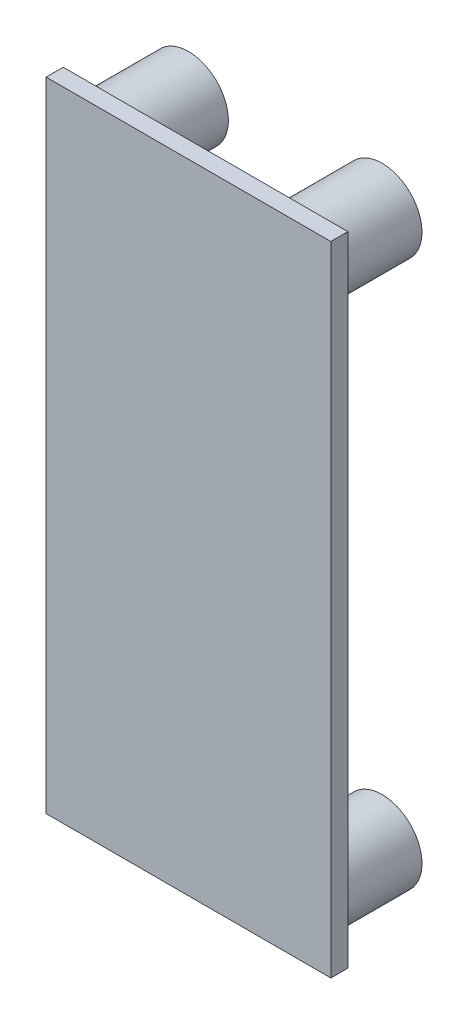
ISO-10303-21;
HEADER;
FILE_DESCRIPTION(('STEP AP214'),'2;1');
FILE_NAME('part.step','',(''),(''),'','','');
FILE_SCHEMA(('AUTOMOTIVE_DESIGN { 1 0 10303 214 1 1 1 1 }'));
ENDSEC;
DATA;
#1=APPLICATION_CONTEXT('core data for automotive mechanical design processes');
#2=APPLICATION_PROTOCOL_DEFINITION('international standard','automotive_design',2000,#1);
#3=PRODUCT_CONTEXT('',#1,'mechanical');
#4=PRODUCT('Part','Part','',(#3));
#5=PRODUCT_RELATED_PRODUCT_CATEGORY('part','',(#4));
#6=PRODUCT_DEFINITION_FORMATION('','',#4);
#7=PRODUCT_DEFINITION_CONTEXT('part definition',#1,'design');
#8=PRODUCT_DEFINITION('design','',#6,#7);
#9=PRODUCT_DEFINITION_SHAPE('','',#8);
#10=(LENGTH_UNIT() NAMED_UNIT(*) SI_UNIT(.MILLI.,.METRE.));
#11=(NAMED_UNIT(*) PLANE_ANGLE_UNIT() SI_UNIT($,.RADIAN.));
#12=(NAMED_UNIT(*) SI_UNIT($,.STERADIAN.) SOLID_ANGLE_UNIT());
#13=UNCERTAINTY_MEASURE_WITH_UNIT(LENGTH_MEASURE(1.E-05),#10,'distance_accuracy_value','');
#14=(GEOMETRIC_REPRESENTATION_CONTEXT(3) GLOBAL_UNCERTAINTY_ASSIGNED_CONTEXT((#13)) GLOBAL_UNIT_ASSIGNED_CONTEXT((#10,
#11,#12)) REPRESENTATION_CONTEXT('',''));
#15=CARTESIAN_POINT('',(0.,0.,0.));
#16=DIRECTION('',(0.,0.,1.));
#17=DIRECTION('',(1.,0.,0.));
#18=AXIS2_PLACEMENT_3D('',#15,#16,#17);
#19=CARTESIAN_POINT('',(0.,0.,1.5));
#20=DIRECTION('',(1.,0.,0.));
#21=DIRECTION('',(0.,1.,0.));
#22=AXIS2_PLACEMENT_3D('',#19,#20,#21);
#23=PLANE('',#22);
#24=DIRECTION('',(0.,-1.,0.));
#25=VECTOR('',#24,1.);
#26=CARTESIAN_POINT('',(0.,0.,0.));
#27=LINE('',#26,#25);
#28=CARTESIAN_POINT('',(0.,56.,0.));
#29=VERTEX_POINT('',#28);
#30=CARTESIAN_POINT('',(0.,0.,0.));
#31=VERTEX_POINT('',#30);
#32=EDGE_CURVE('E111',#29,#31,#27,.T.);
#33=ORIENTED_EDGE('',*,*,#32,.T.);
#34=DIRECTION('',(0.,0.,-1.));
#35=VECTOR('',#34,1.);
#36=CARTESIAN_POINT('',(0.,0.,1.5));
#37=LINE('',#36,#35);
#38=CARTESIAN_POINT('',(0.,0.,1.5));
#39=VERTEX_POINT('',#38);
#40=EDGE_CURVE('E100',#39,#31,#37,.T.);
#41=ORIENTED_EDGE('',*,*,#40,.F.);
#42=DIRECTION('',(0.,-1.,0.));
#43=VECTOR('',#42,1.);
#44=CARTESIAN_POINT('',(0.,0.,1.5));
#45=LINE('',#44,#43);
#46=CARTESIAN_POINT('',(0.,56.,1.5));
#47=VERTEX_POINT('',#46);
#48=EDGE_CURVE('E92',#47,#39,#45,.T.);
#49=ORIENTED_EDGE('',*,*,#48,.F.);
#50=DIRECTION('',(0.,0.,-1.));
#51=VECTOR('',#50,1.);
#52=CARTESIAN_POINT('',(0.,56.,1.5));
#53=LINE('',#52,#51);
#54=EDGE_CURVE('E107',#47,#29,#53,.T.);
#55=ORIENTED_EDGE('',*,*,#54,.T.);
#56=EDGE_LOOP('',(#33,#41,#49,#55));
#57=FACE_BOUND('',#56,.T.);
#58=ADVANCED_FACE('F39',(#57),#23,.F.);
#59=CARTESIAN_POINT('',(0.,0.,1.5));
#60=DIRECTION('',(0.,1.,0.));
#61=DIRECTION('',(0.,0.,1.));
#62=AXIS2_PLACEMENT_3D('',#59,#60,#61);
#63=PLANE('',#62);
#64=DIRECTION('',(1.,0.,0.));
#65=VECTOR('',#64,1.);
#66=CARTESIAN_POINT('',(0.,0.,0.));
#67=LINE('',#66,#65);
#68=CARTESIAN_POINT('',(25.,0.,0.));
#69=VERTEX_POINT('',#68);
#70=EDGE_CURVE('E98',#31,#69,#67,.T.);
#71=ORIENTED_EDGE('',*,*,#70,.T.);
#72=DIRECTION('',(0.,0.,-1.));
#73=VECTOR('',#72,1.);
#74=CARTESIAN_POINT('',(25.,0.,1.5));
#75=LINE('',#74,#73);
#76=CARTESIAN_POINT('',(25.,0.,1.5));
#77=VERTEX_POINT('',#76);
#78=EDGE_CURVE('E96',#77,#69,#75,.T.);
#79=ORIENTED_EDGE('',*,*,#78,.F.);
#80=DIRECTION('',(1.,0.,0.));
#81=VECTOR('',#80,1.);
#82=CARTESIAN_POINT('',(0.,0.,1.5));
#83=LINE('',#82,#81);
#84=EDGE_CURVE('E87',#39,#77,#83,.T.);
#85=ORIENTED_EDGE('',*,*,#84,.F.);
#86=ORIENTED_EDGE('',*,*,#40,.T.);
#87=EDGE_LOOP('',(#71,#79,#85,#86));
#88=FACE_BOUND('',#87,.T.);
#89=ADVANCED_FACE('F97',(#88),#63,.F.);
#90=CARTESIAN_POINT('',(25.,0.,1.5));
#91=DIRECTION('',(-1.,0.,0.));
#92=DIRECTION('',(0.,-1.,0.));
#93=AXIS2_PLACEMENT_3D('',#90,#91,#92);
#94=PLANE('',#93);
#95=DIRECTION('',(0.,1.,0.));
#96=VECTOR('',#95,1.);
#97=CARTESIAN_POINT('',(25.,0.,0.));
#98=LINE('',#97,#96);
#99=CARTESIAN_POINT('',(25.,56.,0.));
#100=VERTEX_POINT('',#99);
#101=EDGE_CURVE('E73',#69,#100,#98,.T.);
#102=ORIENTED_EDGE('',*,*,#101,.T.);
#103=DIRECTION('',(0.,0.,-1.));
#104=VECTOR('',#103,1.);
#105=CARTESIAN_POINT('',(25.,56.,1.5));
#106=LINE('',#105,#104);
#107=CARTESIAN_POINT('',(25.,56.,1.5));
#108=VERTEX_POINT('',#107);
#109=EDGE_CURVE('E101',#108,#100,#106,.T.);
#110=ORIENTED_EDGE('',*,*,#109,.F.);
#111=DIRECTION('',(0.,1.,0.));
#112=VECTOR('',#111,1.);
#113=CARTESIAN_POINT('',(25.,0.,1.5));
#114=LINE('',#113,#112);
#115=EDGE_CURVE('E90',#77,#108,#114,.T.);
#116=ORIENTED_EDGE('',*,*,#115,.F.);
#117=ORIENTED_EDGE('',*,*,#78,.T.);
#118=EDGE_LOOP('',(#102,#110,#116,#117));
#119=FACE_BOUND('',#118,.T.);
#120=ADVANCED_FACE('F103',(#119),#94,.F.);
#121=CARTESIAN_POINT('',(0.,56.,1.5));
#122=DIRECTION('',(0.,-1.,0.));
#123=DIRECTION('',(0.,0.,-1.));
#124=AXIS2_PLACEMENT_3D('',#121,#122,#123);
#125=PLANE('',#124);
#126=DIRECTION('',(-1.,0.,0.));
#127=VECTOR('',#126,1.);
#128=CARTESIAN_POINT('',(0.,56.,0.));
#129=LINE('',#128,#127);
#130=EDGE_CURVE('E79',#100,#29,#129,.T.);
#131=ORIENTED_EDGE('',*,*,#130,.T.);
#132=ORIENTED_EDGE('',*,*,#54,.F.);
#133=DIRECTION('',(-1.,0.,0.));
#134=VECTOR('',#133,1.);
#135=CARTESIAN_POINT('',(0.,56.,1.5));
#136=LINE('',#135,#134);
#137=EDGE_CURVE('E56',#108,#47,#136,.T.);
#138=ORIENTED_EDGE('',*,*,#137,.F.);
#139=ORIENTED_EDGE('',*,*,#109,.T.);
#140=EDGE_LOOP('',(#131,#132,#138,#139));
#141=FACE_BOUND('',#140,.T.);
#142=ADVANCED_FACE('F185',(#141),#125,.F.);
#143=CARTESIAN_POINT('',(0.,0.,1.5));
#144=DIRECTION('',(0.,0.,-1.));
#145=DIRECTION('',(-1.,0.,0.));
#146=AXIS2_PLACEMENT_3D('',#143,#144,#145);
#147=PLANE('',#146);
#148=ORIENTED_EDGE('',*,*,#48,.T.);
#149=ORIENTED_EDGE('',*,*,#84,.T.);
#150=ORIENTED_EDGE('',*,*,#115,.T.);
#151=ORIENTED_EDGE('',*,*,#137,.T.);
#152=EDGE_LOOP('',(#148,#149,#150,#151));
#153=FACE_BOUND('',#152,.T.);
#154=ADVANCED_FACE('F88',(#153),#147,.F.);
#155=CARTESIAN_POINT('',(0.,0.,0.));
#156=DIRECTION('',(0.,0.,-1.));
#157=DIRECTION('',(-1.,0.,0.));
#158=AXIS2_PLACEMENT_3D('',#155,#156,#157);
#159=PLANE('',#158);
#160=CARTESIAN_POINT('',(3.99999999999998,4.2,0.));
#161=DIRECTION('',(0.,0.,-1.));
#162=DIRECTION('',(-1.,0.,0.));
#163=AXIS2_PLACEMENT_3D('',#160,#161,#162);
#164=CIRCLE('',#163,3.5);
#165=CARTESIAN_POINT('',(0.499999999999982,4.2,0.));
#166=VERTEX_POINT('',#165);
#167=EDGE_CURVE('E236',#166,#166,#164,.T.);
#168=ORIENTED_EDGE('',*,*,#167,.F.);
#169=EDGE_LOOP('',(#168));
#170=FACE_BOUND('',#169,.T.);
#171=CARTESIAN_POINT('',(21.,4.2,0.));
#172=DIRECTION('',(0.,0.,-1.));
#173=DIRECTION('',(-1.,0.,0.));
#174=AXIS2_PLACEMENT_3D('',#171,#172,#173);
#175=CIRCLE('',#174,3.5);
#176=CARTESIAN_POINT('',(17.5,4.2,0.));
#177=VERTEX_POINT('',#176);
#178=EDGE_CURVE('E250',#177,#177,#175,.T.);
#179=ORIENTED_EDGE('',*,*,#178,.F.);
#180=EDGE_LOOP('',(#179));
#181=FACE_BOUND('',#180,.T.);
#182=CARTESIAN_POINT('',(3.99999999999999,52.2,0.));
#183=DIRECTION('',(0.,0.,-1.));
#184=DIRECTION('',(-1.,0.,0.));
#185=AXIS2_PLACEMENT_3D('',#182,#183,#184);
#186=CIRCLE('',#185,3.5);
#187=CARTESIAN_POINT('',(0.499999999999987,52.2,0.));
#188=VERTEX_POINT('',#187);
#189=EDGE_CURVE('E262',#188,#188,#186,.T.);
#190=ORIENTED_EDGE('',*,*,#189,.F.);
#191=EDGE_LOOP('',(#190));
#192=FACE_BOUND('',#191,.T.);
#193=CARTESIAN_POINT('',(21.,52.2,0.));
#194=DIRECTION('',(0.,0.,-1.));
#195=DIRECTION('',(-1.,0.,0.));
#196=AXIS2_PLACEMENT_3D('',#193,#194,#195);
#197=CIRCLE('',#196,3.5);
#198=CARTESIAN_POINT('',(17.5,52.2,0.));
#199=VERTEX_POINT('',#198);
#200=EDGE_CURVE('E273',#199,#199,#197,.T.);
#201=ORIENTED_EDGE('',*,*,#200,.F.);
#202=EDGE_LOOP('',(#201));
#203=FACE_BOUND('',#202,.T.);
#204=ORIENTED_EDGE('',*,*,#32,.F.);
#205=ORIENTED_EDGE('',*,*,#130,.F.);
#206=ORIENTED_EDGE('',*,*,#101,.F.);
#207=ORIENTED_EDGE('',*,*,#70,.F.);
#208=EDGE_LOOP('',(#204,#205,#206,#207));
#209=FACE_BOUND('',#208,.T.);
#210=ADVANCED_FACE('F157',(#170,#181,#192,#203,#209),#159,.T.);
#211=CARTESIAN_POINT('',(21.,52.2,-7.));
#212=DIRECTION('',(0.,0.,-1.));
#213=DIRECTION('',(-1.,0.,0.));
#214=AXIS2_PLACEMENT_3D('',#211,#212,#213);
#215=PLANE('',#214);
#216=CARTESIAN_POINT('',(21.,52.2,-7.));
#217=DIRECTION('',(0.,0.,-1.));
#218=DIRECTION('',(-1.,0.,0.));
#219=AXIS2_PLACEMENT_3D('',#216,#217,#218);
#220=CIRCLE('',#219,3.5);
#221=CARTESIAN_POINT('',(17.5,52.2,-7.));
#222=VERTEX_POINT('',#221);
#223=EDGE_CURVE('E115',#222,#222,#220,.T.);
#224=ORIENTED_EDGE('',*,*,#223,.T.);
#225=EDGE_LOOP('',(#224));
#226=FACE_BOUND('',#225,.T.);
#227=CARTESIAN_POINT('',(21.,52.2,-7.));
#228=DIRECTION('',(0.,0.,-1.));
#229=DIRECTION('',(-1.,0.,0.));
#230=AXIS2_PLACEMENT_3D('',#227,#228,#229);
#231=CIRCLE('',#230,1.5);
#232=CARTESIAN_POINT('',(19.5,52.2,-7.));
#233=VERTEX_POINT('',#232);
#234=EDGE_CURVE('E267',#233,#233,#231,.T.);
#235=ORIENTED_EDGE('',*,*,#234,.F.);
#236=EDGE_LOOP('',(#235));
#237=FACE_BOUND('',#236,.T.);
#238=ADVANCED_FACE('F176',(#226,#237),#215,.T.);
#239=CARTESIAN_POINT('',(21.,52.2,-7.));
#240=DIRECTION('',(0.,0.,1.));
#241=DIRECTION('',(1.,0.,0.));
#242=AXIS2_PLACEMENT_3D('',#239,#240,#241);
#243=CYLINDRICAL_SURFACE('',#242,3.5);
#244=ORIENTED_EDGE('',*,*,#223,.F.);
#245=EDGE_LOOP('',(#244));
#246=FACE_BOUND('',#245,.T.);
#247=ORIENTED_EDGE('',*,*,#200,.T.);
#248=EDGE_LOOP('',(#247));
#249=FACE_BOUND('',#248,.T.);
#250=ADVANCED_FACE('F182',(#246,#249),#243,.T.);
#251=CARTESIAN_POINT('',(21.,52.2,-7.));
#252=DIRECTION('',(0.,0.,1.));
#253=DIRECTION('',(1.,0.,0.));
#254=AXIS2_PLACEMENT_3D('',#251,#252,#253);
#255=CYLINDRICAL_SURFACE('',#254,1.5);
#256=ORIENTED_EDGE('',*,*,#234,.T.);
#257=EDGE_LOOP('',(#256));
#258=FACE_BOUND('',#257,.T.);
#259=CARTESIAN_POINT('',(21.,52.2,0.));
#260=DIRECTION('',(0.,0.,-1.));
#261=DIRECTION('',(-1.,0.,0.));
#262=AXIS2_PLACEMENT_3D('',#259,#260,#261);
#263=CIRCLE('',#262,1.5);
#264=CARTESIAN_POINT('',(19.5,52.2,0.));
#265=VERTEX_POINT('',#264);
#266=EDGE_CURVE('E128',#265,#265,#263,.F.);
#267=ORIENTED_EDGE('',*,*,#266,.T.);
#268=EDGE_LOOP('',(#267));
#269=FACE_BOUND('',#268,.T.);
#270=ADVANCED_FACE('F190',(#258,#269),#255,.F.);
#271=ORIENTED_EDGE('',*,*,#266,.F.);
#272=EDGE_LOOP('',(#271));
#273=FACE_BOUND('',#272,.T.);
#274=ADVANCED_FACE('F164',(#273),#159,.T.);
#275=CARTESIAN_POINT('',(3.99999999999999,52.2,-7.));
#276=DIRECTION('',(0.,0.,-1.));
#277=DIRECTION('',(-1.,0.,0.));
#278=AXIS2_PLACEMENT_3D('',#275,#276,#277);
#279=PLANE('',#278);
#280=CARTESIAN_POINT('',(3.99999999999999,52.2,-7.));
#281=DIRECTION('',(0.,0.,-1.));
#282=DIRECTION('',(-1.,0.,0.));
#283=AXIS2_PLACEMENT_3D('',#280,#281,#282);
#284=CIRCLE('',#283,3.5);
#285=CARTESIAN_POINT('',(0.499999999999987,52.2,-7.));
#286=VERTEX_POINT('',#285);
#287=EDGE_CURVE('E263',#286,#286,#284,.T.);
#288=ORIENTED_EDGE('',*,*,#287,.T.);
#289=EDGE_LOOP('',(#288));
#290=FACE_BOUND('',#289,.T.);
#291=CARTESIAN_POINT('',(3.99999999999999,52.2,-7.));
#292=DIRECTION('',(0.,0.,-1.));
#293=DIRECTION('',(-1.,0.,0.));
#294=AXIS2_PLACEMENT_3D('',#291,#292,#293);
#295=CIRCLE('',#294,1.5);
#296=CARTESIAN_POINT('',(2.49999999999999,52.2,-7.));
#297=VERTEX_POINT('',#296);
#298=EDGE_CURVE('E255',#297,#297,#295,.T.);
#299=ORIENTED_EDGE('',*,*,#298,.F.);
#300=EDGE_LOOP('',(#299));
#301=FACE_BOUND('',#300,.T.);
#302=ADVANCED_FACE('F189',(#290,#301),#279,.T.);
#303=CARTESIAN_POINT('',(3.99999999999999,52.2,-7.));
#304=DIRECTION('',(0.,0.,1.));
#305=DIRECTION('',(1.,0.,0.));
#306=AXIS2_PLACEMENT_3D('',#303,#304,#305);
#307=CYLINDRICAL_SURFACE('',#306,3.5);
#308=ORIENTED_EDGE('',*,*,#287,.F.);
#309=EDGE_LOOP('',(#308));
#310=FACE_BOUND('',#309,.T.);
#311=ORIENTED_EDGE('',*,*,#189,.T.);
#312=EDGE_LOOP('',(#311));
#313=FACE_BOUND('',#312,.T.);
#314=ADVANCED_FACE('F196',(#310,#313),#307,.T.);
#315=CARTESIAN_POINT('',(3.99999999999999,52.2,-7.));
#316=DIRECTION('',(0.,0.,1.));
#317=DIRECTION('',(1.,0.,0.));
#318=AXIS2_PLACEMENT_3D('',#315,#316,#317);
#319=CYLINDRICAL_SURFACE('',#318,1.5);
#320=ORIENTED_EDGE('',*,*,#298,.T.);
#321=EDGE_LOOP('',(#320));
#322=FACE_BOUND('',#321,.T.);
#323=CARTESIAN_POINT('',(3.99999999999999,52.2,0.));
#324=DIRECTION('',(0.,0.,-1.));
#325=DIRECTION('',(-1.,0.,0.));
#326=AXIS2_PLACEMENT_3D('',#323,#324,#325);
#327=CIRCLE('',#326,1.5);
#328=CARTESIAN_POINT('',(2.49999999999999,52.2,0.));
#329=VERTEX_POINT('',#328);
#330=EDGE_CURVE('E132',#329,#329,#327,.F.);
#331=ORIENTED_EDGE('',*,*,#330,.T.);
#332=EDGE_LOOP('',(#331));
#333=FACE_BOUND('',#332,.T.);
#334=ADVANCED_FACE('F162',(#322,#333),#319,.F.);
#335=ORIENTED_EDGE('',*,*,#330,.F.);
#336=EDGE_LOOP('',(#335));
#337=FACE_BOUND('',#336,.T.);
#338=ADVANCED_FACE('F145',(#337),#159,.T.);
#339=CARTESIAN_POINT('',(21.,4.2,-7.));
#340=DIRECTION('',(0.,0.,-1.));
#341=DIRECTION('',(-1.,0.,0.));
#342=AXIS2_PLACEMENT_3D('',#339,#340,#341);
#343=PLANE('',#342);
#344=CARTESIAN_POINT('',(21.,4.2,-7.));
#345=DIRECTION('',(0.,0.,-1.));
#346=DIRECTION('',(-1.,0.,0.));
#347=AXIS2_PLACEMENT_3D('',#344,#345,#346);
#348=CIRCLE('',#347,3.5);
#349=CARTESIAN_POINT('',(17.5,4.2,-7.));
#350=VERTEX_POINT('',#349);
#351=EDGE_CURVE('E251',#350,#350,#348,.T.);
#352=ORIENTED_EDGE('',*,*,#351,.T.);
#353=EDGE_LOOP('',(#352));
#354=FACE_BOUND('',#353,.T.);
#355=CARTESIAN_POINT('',(21.,4.2,-7.));
#356=DIRECTION('',(0.,0.,-1.));
#357=DIRECTION('',(-1.,0.,0.));
#358=AXIS2_PLACEMENT_3D('',#355,#356,#357);
#359=CIRCLE('',#358,1.5);
#360=CARTESIAN_POINT('',(19.5,4.2,-7.));
#361=VERTEX_POINT('',#360);
#362=EDGE_CURVE('E245',#361,#361,#359,.T.);
#363=ORIENTED_EDGE('',*,*,#362,.F.);
#364=EDGE_LOOP('',(#363));
#365=FACE_BOUND('',#364,.T.);
#366=ADVANCED_FACE('F161',(#354,#365),#343,.T.);
#367=CARTESIAN_POINT('',(21.,4.2,-7.));
#368=DIRECTION('',(0.,0.,1.));
#369=DIRECTION('',(1.,0.,0.));
#370=AXIS2_PLACEMENT_3D('',#367,#368,#369);
#371=CYLINDRICAL_SURFACE('',#370,3.5);
#372=ORIENTED_EDGE('',*,*,#351,.F.);
#373=EDGE_LOOP('',(#372));
#374=FACE_BOUND('',#373,.T.);
#375=ORIENTED_EDGE('',*,*,#178,.T.);
#376=EDGE_LOOP('',(#375));
#377=FACE_BOUND('',#376,.T.);
#378=ADVANCED_FACE('F154',(#374,#377),#371,.T.);
#379=CARTESIAN_POINT('',(21.,4.2,-7.));
#380=DIRECTION('',(0.,0.,1.));
#381=DIRECTION('',(1.,0.,0.));
#382=AXIS2_PLACEMENT_3D('',#379,#380,#381);
#383=CYLINDRICAL_SURFACE('',#382,1.5);
#384=ORIENTED_EDGE('',*,*,#362,.T.);
#385=EDGE_LOOP('',(#384));
#386=FACE_BOUND('',#385,.T.);
#387=CARTESIAN_POINT('',(21.,4.2,0.));
#388=DIRECTION('',(0.,0.,-1.));
#389=DIRECTION('',(-1.,0.,0.));
#390=AXIS2_PLACEMENT_3D('',#387,#388,#389);
#391=CIRCLE('',#390,1.5);
#392=CARTESIAN_POINT('',(19.5,4.2,0.));
#393=VERTEX_POINT('',#392);
#394=EDGE_CURVE('E48',#393,#393,#391,.F.);
#395=ORIENTED_EDGE('',*,*,#394,.T.);
#396=EDGE_LOOP('',(#395));
#397=FACE_BOUND('',#396,.T.);
#398=ADVANCED_FACE('F139',(#386,#397),#383,.F.);
#399=ORIENTED_EDGE('',*,*,#394,.F.);
#400=EDGE_LOOP('',(#399));
#401=FACE_BOUND('',#400,.T.);
#402=ADVANCED_FACE('F141',(#401),#159,.T.);
#403=CARTESIAN_POINT('',(3.99999999999998,4.2,-7.));
#404=DIRECTION('',(0.,0.,-1.));
#405=DIRECTION('',(-1.,0.,0.));
#406=AXIS2_PLACEMENT_3D('',#403,#404,#405);
#407=PLANE('',#406);
#408=CARTESIAN_POINT('',(3.99999999999998,4.2,-7.));
#409=DIRECTION('',(0.,0.,-1.));
#410=DIRECTION('',(-1.,0.,0.));
#411=AXIS2_PLACEMENT_3D('',#408,#409,#410);
#412=CIRCLE('',#411,3.5);
#413=CARTESIAN_POINT('',(0.499999999999982,4.2,-7.));
#414=VERTEX_POINT('',#413);
#415=EDGE_CURVE('E240',#414,#414,#412,.T.);
#416=ORIENTED_EDGE('',*,*,#415,.T.);
#417=EDGE_LOOP('',(#416));
#418=FACE_BOUND('',#417,.T.);
#419=CARTESIAN_POINT('',(3.99999999999998,4.2,-7.));
#420=DIRECTION('',(0.,0.,-1.));
#421=DIRECTION('',(-1.,0.,0.));
#422=AXIS2_PLACEMENT_3D('',#419,#420,#421);
#423=CIRCLE('',#422,1.5);
#424=CARTESIAN_POINT('',(2.49999999999998,4.2,-7.));
#425=VERTEX_POINT('',#424);
#426=EDGE_CURVE('E232',#425,#425,#423,.T.);
#427=ORIENTED_EDGE('',*,*,#426,.F.);
#428=EDGE_LOOP('',(#427));
#429=FACE_BOUND('',#428,.T.);
#430=ADVANCED_FACE('F143',(#418,#429),#407,.T.);
#431=CARTESIAN_POINT('',(3.99999999999998,4.2,-7.));
#432=DIRECTION('',(0.,0.,1.));
#433=DIRECTION('',(1.,0.,0.));
#434=AXIS2_PLACEMENT_3D('',#431,#432,#433);
#435=CYLINDRICAL_SURFACE('',#434,3.5);
#436=ORIENTED_EDGE('',*,*,#415,.F.);
#437=EDGE_LOOP('',(#436));
#438=FACE_BOUND('',#437,.T.);
#439=ORIENTED_EDGE('',*,*,#167,.T.);
#440=EDGE_LOOP('',(#439));
#441=FACE_BOUND('',#440,.T.);
#442=ADVANCED_FACE('F151',(#438,#441),#435,.T.);
#443=CARTESIAN_POINT('',(3.99999999999998,4.2,-7.));
#444=DIRECTION('',(0.,0.,1.));
#445=DIRECTION('',(1.,0.,0.));
#446=AXIS2_PLACEMENT_3D('',#443,#444,#445);
#447=CYLINDRICAL_SURFACE('',#446,1.5);
#448=ORIENTED_EDGE('',*,*,#426,.T.);
#449=EDGE_LOOP('',(#448));
#450=FACE_BOUND('',#449,.T.);
#451=CARTESIAN_POINT('',(3.99999999999998,4.2,0.));
#452=DIRECTION('',(0.,0.,-1.));
#453=DIRECTION('',(-1.,0.,0.));
#454=AXIS2_PLACEMENT_3D('',#451,#452,#453);
#455=CIRCLE('',#454,1.5);
#456=CARTESIAN_POINT('',(2.49999999999998,4.2,0.));
#457=VERTEX_POINT('',#456);
#458=EDGE_CURVE('E11',#457,#457,#455,.F.);
#459=ORIENTED_EDGE('',*,*,#458,.T.);
#460=EDGE_LOOP('',(#459));
#461=FACE_BOUND('',#460,.T.);
#462=ADVANCED_FACE('F166',(#450,#461),#447,.F.);
#463=ORIENTED_EDGE('',*,*,#458,.F.);
#464=EDGE_LOOP('',(#463));
#465=FACE_BOUND('',#464,.T.);
#466=ADVANCED_FACE('F146',(#465),#159,.T.);
#467=CLOSED_SHELL('',(#58,#89,#120,#142,#154,#210,#238,#250,#270,#274,#302,#314,#334,#338,#366,
#378,#398,#402,#430,#442,#462,#466));
#468=MANIFOLD_SOLID_BREP('B2',#467);
#469=ADVANCED_BREP_SHAPE_REPRESENTATION('',(#18,#468),#14);
#470=SHAPE_DEFINITION_REPRESENTATION(#9,#469);
ENDSEC;
END-ISO-10303-21;
